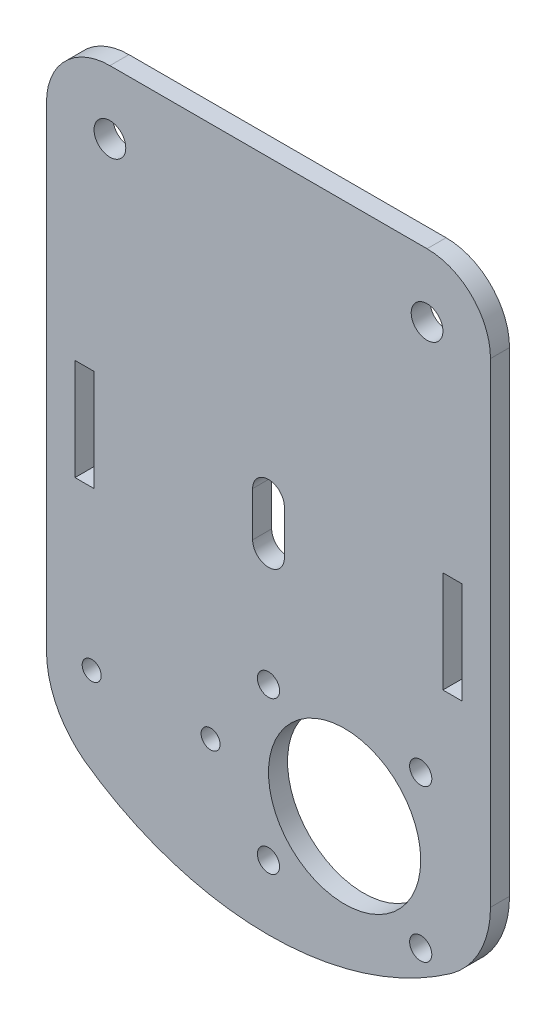
ISO-10303-21;
HEADER;
FILE_DESCRIPTION(('STEP AP214'),'2;1');
FILE_NAME('part.step','',(''),(''),'','','');
FILE_SCHEMA(('AUTOMOTIVE_DESIGN { 1 0 10303 214 1 1 1 1 }'));
ENDSEC;
DATA;
#1=APPLICATION_CONTEXT('core data for automotive mechanical design processes');
#2=APPLICATION_PROTOCOL_DEFINITION('international standard','automotive_design',2000,#1);
#3=PRODUCT_CONTEXT('',#1,'mechanical');
#4=PRODUCT('Part','Part','',(#3));
#5=PRODUCT_RELATED_PRODUCT_CATEGORY('part','',(#4));
#6=PRODUCT_DEFINITION_FORMATION('','',#4);
#7=PRODUCT_DEFINITION_CONTEXT('part definition',#1,'design');
#8=PRODUCT_DEFINITION('design','',#6,#7);
#9=PRODUCT_DEFINITION_SHAPE('','',#8);
#10=(LENGTH_UNIT() NAMED_UNIT(*) SI_UNIT(.MILLI.,.METRE.));
#11=(NAMED_UNIT(*) PLANE_ANGLE_UNIT() SI_UNIT($,.RADIAN.));
#12=(NAMED_UNIT(*) SI_UNIT($,.STERADIAN.) SOLID_ANGLE_UNIT());
#13=UNCERTAINTY_MEASURE_WITH_UNIT(LENGTH_MEASURE(1.E-05),#10,'distance_accuracy_value','');
#14=(GEOMETRIC_REPRESENTATION_CONTEXT(3) GLOBAL_UNCERTAINTY_ASSIGNED_CONTEXT((#13)) GLOBAL_UNIT_ASSIGNED_CONTEXT((#10,
#11,#12)) REPRESENTATION_CONTEXT('',''));
#15=CARTESIAN_POINT('',(0.,0.,0.));
#16=DIRECTION('',(0.,0.,1.));
#17=DIRECTION('',(1.,0.,0.));
#18=AXIS2_PLACEMENT_3D('',#15,#16,#17);
#19=CARTESIAN_POINT('',(0.,0.,3.));
#20=DIRECTION('',(0.,0.,1.));
#21=DIRECTION('',(1.,0.,0.));
#22=AXIS2_PLACEMENT_3D('',#19,#20,#21);
#23=PLANE('',#22);
#24=CARTESIAN_POINT('',(-27.875,-54.,3.));
#25=DIRECTION('',(0.,0.,1.));
#26=DIRECTION('',(1.,0.,0.));
#27=AXIS2_PLACEMENT_3D('',#24,#25,#26);
#28=CIRCLE('',#27,1.5);
#29=CARTESIAN_POINT('',(-26.375,-54.,3.));
#30=VERTEX_POINT('',#29);
#31=EDGE_CURVE('E514',#30,#30,#28,.T.);
#32=ORIENTED_EDGE('',*,*,#31,.F.);
#33=EDGE_LOOP('',(#32));
#34=FACE_BOUND('',#33,.T.);
#35=CARTESIAN_POINT('',(-9.12499999999999,-54.,3.));
#36=DIRECTION('',(0.,0.,1.));
#37=DIRECTION('',(1.,0.,0.));
#38=AXIS2_PLACEMENT_3D('',#35,#36,#37);
#39=CIRCLE('',#38,1.5);
#40=CARTESIAN_POINT('',(-7.62499999999999,-54.,3.));
#41=VERTEX_POINT('',#40);
#42=EDGE_CURVE('E202',#41,#41,#39,.T.);
#43=ORIENTED_EDGE('',*,*,#42,.F.);
#44=EDGE_LOOP('',(#43));
#45=FACE_BOUND('',#44,.T.);
#46=DIRECTION('',(0.,-1.,0.));
#47=VECTOR('',#46,1.);
#48=CARTESIAN_POINT('',(27.499999999993,-13.,3.));
#49=LINE('',#48,#47);
#50=CARTESIAN_POINT('',(27.499999999993,-13.,3.));
#51=VERTEX_POINT('',#50);
#52=CARTESIAN_POINT('',(27.499999999993,-29.,3.));
#53=VERTEX_POINT('',#52);
#54=EDGE_CURVE('E54',#51,#53,#49,.T.);
#55=ORIENTED_EDGE('',*,*,#54,.F.);
#56=DIRECTION('',(-1.,0.,0.));
#57=VECTOR('',#56,1.);
#58=CARTESIAN_POINT('',(27.499999999993,-13.,3.));
#59=LINE('',#58,#57);
#60=CARTESIAN_POINT('',(30.499999999993,-13.,3.));
#61=VERTEX_POINT('',#60);
#62=EDGE_CURVE('E196',#61,#51,#59,.T.);
#63=ORIENTED_EDGE('',*,*,#62,.F.);
#64=DIRECTION('',(0.,1.,0.));
#65=VECTOR('',#64,1.);
#66=CARTESIAN_POINT('',(30.499999999993,-13.,3.));
#67=LINE('',#66,#65);
#68=CARTESIAN_POINT('',(30.499999999993,-29.,3.));
#69=VERTEX_POINT('',#68);
#70=EDGE_CURVE('E199',#69,#61,#67,.T.);
#71=ORIENTED_EDGE('',*,*,#70,.F.);
#72=DIRECTION('',(1.,0.,0.));
#73=VECTOR('',#72,1.);
#74=CARTESIAN_POINT('',(27.499999999993,-29.,3.));
#75=LINE('',#74,#73);
#76=EDGE_CURVE('E208',#53,#69,#75,.T.);
#77=ORIENTED_EDGE('',*,*,#76,.F.);
#78=EDGE_LOOP('',(#55,#63,#71,#77));
#79=FACE_BOUND('',#78,.T.);
#80=DIRECTION('',(-1.,0.,0.));
#81=VECTOR('',#80,1.);
#82=CARTESIAN_POINT('',(-27.499999999993,-13.,3.));
#83=LINE('',#82,#81);
#84=CARTESIAN_POINT('',(-27.499999999993,-13.,3.));
#85=VERTEX_POINT('',#84);
#86=CARTESIAN_POINT('',(-30.499999999993,-13.,3.));
#87=VERTEX_POINT('',#86);
#88=EDGE_CURVE('E62',#85,#87,#83,.T.);
#89=ORIENTED_EDGE('',*,*,#88,.F.);
#90=DIRECTION('',(0.,1.,0.));
#91=VECTOR('',#90,1.);
#92=CARTESIAN_POINT('',(-27.499999999993,-13.,3.));
#93=LINE('',#92,#91);
#94=CARTESIAN_POINT('',(-27.499999999993,-29.,3.));
#95=VERTEX_POINT('',#94);
#96=EDGE_CURVE('E223',#95,#85,#93,.T.);
#97=ORIENTED_EDGE('',*,*,#96,.F.);
#98=DIRECTION('',(1.,0.,0.));
#99=VECTOR('',#98,1.);
#100=CARTESIAN_POINT('',(-27.499999999993,-29.,3.));
#101=LINE('',#100,#99);
#102=CARTESIAN_POINT('',(-30.499999999993,-29.,3.));
#103=VERTEX_POINT('',#102);
#104=EDGE_CURVE('E238',#103,#95,#101,.T.);
#105=ORIENTED_EDGE('',*,*,#104,.F.);
#106=DIRECTION('',(0.,-1.,0.));
#107=VECTOR('',#106,1.);
#108=CARTESIAN_POINT('',(-30.499999999993,-13.,3.));
#109=LINE('',#108,#107);
#110=EDGE_CURVE('E234',#87,#103,#109,.T.);
#111=ORIENTED_EDGE('',*,*,#110,.F.);
#112=EDGE_LOOP('',(#89,#97,#105,#111));
#113=FACE_BOUND('',#112,.T.);
#114=CARTESIAN_POINT('',(0.,-42.,3.));
#115=DIRECTION('',(0.,0.,1.));
#116=DIRECTION('',(1.,0.,0.));
#117=AXIS2_PLACEMENT_3D('',#114,#115,#116);
#118=CIRCLE('',#117,1.75);
#119=CARTESIAN_POINT('',(1.75,-42.,3.));
#120=VERTEX_POINT('',#119);
#121=EDGE_CURVE('E265',#120,#120,#118,.T.);
#122=ORIENTED_EDGE('',*,*,#121,.F.);
#123=EDGE_LOOP('',(#122));
#124=FACE_BOUND('',#123,.T.);
#125=CARTESIAN_POINT('',(0.,-66.,3.));
#126=DIRECTION('',(0.,0.,1.));
#127=DIRECTION('',(1.,0.,0.));
#128=AXIS2_PLACEMENT_3D('',#125,#126,#127);
#129=CIRCLE('',#128,1.75);
#130=CARTESIAN_POINT('',(1.75,-66.,3.));
#131=VERTEX_POINT('',#130);
#132=EDGE_CURVE('E258',#131,#131,#129,.T.);
#133=ORIENTED_EDGE('',*,*,#132,.F.);
#134=EDGE_LOOP('',(#133));
#135=FACE_BOUND('',#134,.T.);
#136=CARTESIAN_POINT('',(12.,-54.,3.));
#137=DIRECTION('',(0.,0.,1.));
#138=DIRECTION('',(1.,0.,0.));
#139=AXIS2_PLACEMENT_3D('',#136,#137,#138);
#140=CIRCLE('',#139,12.);
#141=CARTESIAN_POINT('',(24.,-54.,3.));
#142=VERTEX_POINT('',#141);
#143=EDGE_CURVE('E215',#142,#142,#140,.T.);
#144=ORIENTED_EDGE('',*,*,#143,.F.);
#145=EDGE_LOOP('',(#144));
#146=FACE_BOUND('',#145,.T.);
#147=CARTESIAN_POINT('',(24.,-66.,3.));
#148=DIRECTION('',(0.,0.,1.));
#149=DIRECTION('',(1.,0.,0.));
#150=AXIS2_PLACEMENT_3D('',#147,#148,#149);
#151=CIRCLE('',#150,1.75);
#152=CARTESIAN_POINT('',(25.75,-66.,3.));
#153=VERTEX_POINT('',#152);
#154=EDGE_CURVE('E252',#153,#153,#151,.T.);
#155=ORIENTED_EDGE('',*,*,#154,.F.);
#156=EDGE_LOOP('',(#155));
#157=FACE_BOUND('',#156,.T.);
#158=CARTESIAN_POINT('',(24.,-42.,3.));
#159=DIRECTION('',(0.,0.,1.));
#160=DIRECTION('',(1.,0.,0.));
#161=AXIS2_PLACEMENT_3D('',#158,#159,#160);
#162=CIRCLE('',#161,1.75);
#163=CARTESIAN_POINT('',(25.75,-42.,3.));
#164=VERTEX_POINT('',#163);
#165=EDGE_CURVE('E264',#164,#164,#162,.T.);
#166=ORIENTED_EDGE('',*,*,#165,.F.);
#167=EDGE_LOOP('',(#166));
#168=FACE_BOUND('',#167,.T.);
#169=CARTESIAN_POINT('',(25.,20.,3.));
#170=DIRECTION('',(0.,0.,1.));
#171=DIRECTION('',(1.,0.,0.));
#172=AXIS2_PLACEMENT_3D('',#169,#170,#171);
#173=CIRCLE('',#172,2.5);
#174=CARTESIAN_POINT('',(27.5,20.,3.));
#175=VERTEX_POINT('',#174);
#176=EDGE_CURVE('E317',#175,#175,#173,.T.);
#177=ORIENTED_EDGE('',*,*,#176,.F.);
#178=EDGE_LOOP('',(#177));
#179=FACE_BOUND('',#178,.T.);
#180=CARTESIAN_POINT('',(0.,-26.1955740754296,3.));
#181=DIRECTION('',(0.,0.,1.));
#182=DIRECTION('',(1.,0.,0.));
#183=AXIS2_PLACEMENT_3D('',#180,#181,#182);
#184=CIRCLE('',#183,50.);
#185=CARTESIAN_POINT('',(-28.8396434946598,-67.0400959002831,3.));
#186=VERTEX_POINT('',#185);
#187=CARTESIAN_POINT('',(28.8396434946598,-67.0400959002831,3.));
#188=VERTEX_POINT('',#187);
#189=EDGE_CURVE('E357',#186,#188,#184,.T.);
#190=ORIENTED_EDGE('',*,*,#189,.T.);
#191=CARTESIAN_POINT('',(20.,-54.9214861249285,3.));
#192=DIRECTION('',(0.,0.,1.));
#193=DIRECTION('',(1.,0.,0.));
#194=AXIS2_PLACEMENT_3D('',#191,#192,#193);
#195=CIRCLE('',#194,15.);
#196=CARTESIAN_POINT('',(35.,-54.9214861249285,3.));
#197=VERTEX_POINT('',#196);
#198=EDGE_CURVE('E359',#188,#197,#195,.T.);
#199=ORIENTED_EDGE('',*,*,#198,.T.);
#200=DIRECTION('',(0.,1.,0.));
#201=VECTOR('',#200,1.);
#202=CARTESIAN_POINT('',(35.,30.,3.));
#203=LINE('',#202,#201);
#204=CARTESIAN_POINT('',(35.,20.,3.));
#205=VERTEX_POINT('',#204);
#206=EDGE_CURVE('E323',#197,#205,#203,.T.);
#207=ORIENTED_EDGE('',*,*,#206,.T.);
#208=CARTESIAN_POINT('',(25.,20.,3.));
#209=DIRECTION('',(0.,0.,1.));
#210=DIRECTION('',(1.,0.,0.));
#211=AXIS2_PLACEMENT_3D('',#208,#209,#210);
#212=CIRCLE('',#211,10.);
#213=CARTESIAN_POINT('',(25.,30.,3.));
#214=VERTEX_POINT('',#213);
#215=EDGE_CURVE('E351',#205,#214,#212,.T.);
#216=ORIENTED_EDGE('',*,*,#215,.T.);
#217=DIRECTION('',(-1.,0.,0.));
#218=VECTOR('',#217,1.);
#219=CARTESIAN_POINT('',(-35.,30.,3.));
#220=LINE('',#219,#218);
#221=CARTESIAN_POINT('',(-25.,30.,3.));
#222=VERTEX_POINT('',#221);
#223=EDGE_CURVE('E326',#214,#222,#220,.T.);
#224=ORIENTED_EDGE('',*,*,#223,.T.);
#225=CARTESIAN_POINT('',(-25.,20.,3.));
#226=DIRECTION('',(0.,0.,1.));
#227=DIRECTION('',(1.,0.,0.));
#228=AXIS2_PLACEMENT_3D('',#225,#226,#227);
#229=CIRCLE('',#228,10.);
#230=CARTESIAN_POINT('',(-35.,20.,3.));
#231=VERTEX_POINT('',#230);
#232=EDGE_CURVE('E353',#222,#231,#229,.T.);
#233=ORIENTED_EDGE('',*,*,#232,.T.);
#234=DIRECTION('',(0.,-1.,0.));
#235=VECTOR('',#234,1.);
#236=CARTESIAN_POINT('',(-35.,-62.6407545543055,3.));
#237=LINE('',#236,#235);
#238=CARTESIAN_POINT('',(-35.,-54.9214861249285,3.));
#239=VERTEX_POINT('',#238);
#240=EDGE_CURVE('E330',#231,#239,#237,.T.);
#241=ORIENTED_EDGE('',*,*,#240,.T.);
#242=CARTESIAN_POINT('',(-20.,-54.9214861249285,3.));
#243=DIRECTION('',(0.,0.,1.));
#244=DIRECTION('',(1.,0.,0.));
#245=AXIS2_PLACEMENT_3D('',#242,#243,#244);
#246=CIRCLE('',#245,15.);
#247=EDGE_CURVE('E355',#239,#186,#246,.T.);
#248=ORIENTED_EDGE('',*,*,#247,.T.);
#249=EDGE_LOOP('',(#190,#199,#207,#216,#224,#233,#241,#248));
#250=FACE_BOUND('',#249,.T.);
#251=CARTESIAN_POINT('',(-25.,20.,3.));
#252=DIRECTION('',(0.,0.,1.));
#253=DIRECTION('',(1.,0.,0.));
#254=AXIS2_PLACEMENT_3D('',#251,#252,#253);
#255=CIRCLE('',#254,2.5);
#256=CARTESIAN_POINT('',(-22.5,20.,3.));
#257=VERTEX_POINT('',#256);
#258=EDGE_CURVE('E311',#257,#257,#255,.T.);
#259=ORIENTED_EDGE('',*,*,#258,.F.);
#260=EDGE_LOOP('',(#259));
#261=FACE_BOUND('',#260,.T.);
#262=DIRECTION('',(0.,-1.,0.));
#263=VECTOR('',#262,1.);
#264=CARTESIAN_POINT('',(-2.50000000000698,-16.5,3.));
#265=LINE('',#264,#263);
#266=CARTESIAN_POINT('',(-2.50000000000698,-16.5,3.));
#267=VERTEX_POINT('',#266);
#268=CARTESIAN_POINT('',(-2.50000000000698,-23.5,3.));
#269=VERTEX_POINT('',#268);
#270=EDGE_CURVE('E281',#267,#269,#265,.T.);
#271=ORIENTED_EDGE('',*,*,#270,.F.);
#272=CARTESIAN_POINT('',(-6.97987588455585E-12,-16.5000000000001,3.));
#273=DIRECTION('',(0.,0.,1.));
#274=DIRECTION('',(1.,0.,0.));
#275=AXIS2_PLACEMENT_3D('',#272,#273,#274);
#276=CIRCLE('',#275,2.5);
#277=CARTESIAN_POINT('',(2.49999999999302,-16.5,3.));
#278=VERTEX_POINT('',#277);
#279=EDGE_CURVE('E279',#278,#267,#276,.T.);
#280=ORIENTED_EDGE('',*,*,#279,.F.);
#281=DIRECTION('',(0.,1.,0.));
#282=VECTOR('',#281,1.);
#283=CARTESIAN_POINT('',(2.49999999999302,-16.5,3.));
#284=LINE('',#283,#282);
#285=CARTESIAN_POINT('',(2.49999999999302,-23.5,3.));
#286=VERTEX_POINT('',#285);
#287=EDGE_CURVE('E287',#286,#278,#284,.T.);
#288=ORIENTED_EDGE('',*,*,#287,.F.);
#289=CARTESIAN_POINT('',(-6.98116176369495E-12,-23.5,3.));
#290=DIRECTION('',(0.,0.,1.));
#291=DIRECTION('',(1.,0.,0.));
#292=AXIS2_PLACEMENT_3D('',#289,#290,#291);
#293=CIRCLE('',#292,2.5);
#294=EDGE_CURVE('E284',#269,#286,#293,.T.);
#295=ORIENTED_EDGE('',*,*,#294,.F.);
#296=EDGE_LOOP('',(#271,#280,#288,#295));
#297=FACE_BOUND('',#296,.T.);
#298=ADVANCED_FACE('F37',(#34,#45,#79,#113,#124,#135,#146,#157,#168,#179,#250,#261,#297),#23,.T.);
#299=CARTESIAN_POINT('',(0.,0.,0.));
#300=DIRECTION('',(0.,0.,1.));
#301=DIRECTION('',(1.,0.,0.));
#302=AXIS2_PLACEMENT_3D('',#299,#300,#301);
#303=PLANE('',#302);
#304=CARTESIAN_POINT('',(-27.875,-54.,0.));
#305=DIRECTION('',(0.,0.,1.));
#306=DIRECTION('',(1.,0.,0.));
#307=AXIS2_PLACEMENT_3D('',#304,#305,#306);
#308=CIRCLE('',#307,1.5);
#309=CARTESIAN_POINT('',(-26.375,-54.,0.));
#310=VERTEX_POINT('',#309);
#311=EDGE_CURVE('E235',#310,#310,#308,.T.);
#312=ORIENTED_EDGE('',*,*,#311,.T.);
#313=EDGE_LOOP('',(#312));
#314=FACE_BOUND('',#313,.T.);
#315=CARTESIAN_POINT('',(-9.12499999999999,-54.,0.));
#316=DIRECTION('',(0.,0.,1.));
#317=DIRECTION('',(1.,0.,0.));
#318=AXIS2_PLACEMENT_3D('',#315,#316,#317);
#319=CIRCLE('',#318,1.5);
#320=CARTESIAN_POINT('',(-7.62499999999999,-54.,0.));
#321=VERTEX_POINT('',#320);
#322=EDGE_CURVE('E515',#321,#321,#319,.T.);
#323=ORIENTED_EDGE('',*,*,#322,.T.);
#324=EDGE_LOOP('',(#323));
#325=FACE_BOUND('',#324,.T.);
#326=DIRECTION('',(-1.,0.,0.));
#327=VECTOR('',#326,1.);
#328=CARTESIAN_POINT('',(27.499999999993,-13.,0.));
#329=LINE('',#328,#327);
#330=CARTESIAN_POINT('',(30.499999999993,-13.,0.));
#331=VERTEX_POINT('',#330);
#332=CARTESIAN_POINT('',(27.499999999993,-13.,0.));
#333=VERTEX_POINT('',#332);
#334=EDGE_CURVE('E183',#331,#333,#329,.T.);
#335=ORIENTED_EDGE('',*,*,#334,.T.);
#336=DIRECTION('',(0.,-1.,0.));
#337=VECTOR('',#336,1.);
#338=CARTESIAN_POINT('',(27.499999999993,-13.,0.));
#339=LINE('',#338,#337);
#340=CARTESIAN_POINT('',(27.499999999993,-29.,0.));
#341=VERTEX_POINT('',#340);
#342=EDGE_CURVE('E177',#333,#341,#339,.T.);
#343=ORIENTED_EDGE('',*,*,#342,.T.);
#344=DIRECTION('',(1.,0.,0.));
#345=VECTOR('',#344,1.);
#346=CARTESIAN_POINT('',(27.499999999993,-29.,0.));
#347=LINE('',#346,#345);
#348=CARTESIAN_POINT('',(30.499999999993,-29.,0.));
#349=VERTEX_POINT('',#348);
#350=EDGE_CURVE('E187',#341,#349,#347,.T.);
#351=ORIENTED_EDGE('',*,*,#350,.T.);
#352=DIRECTION('',(0.,1.,0.));
#353=VECTOR('',#352,1.);
#354=CARTESIAN_POINT('',(30.499999999993,-13.,0.));
#355=LINE('',#354,#353);
#356=EDGE_CURVE('E191',#349,#331,#355,.T.);
#357=ORIENTED_EDGE('',*,*,#356,.T.);
#358=EDGE_LOOP('',(#335,#343,#351,#357));
#359=FACE_BOUND('',#358,.T.);
#360=DIRECTION('',(0.,1.,0.));
#361=VECTOR('',#360,1.);
#362=CARTESIAN_POINT('',(-27.499999999993,-13.,0.));
#363=LINE('',#362,#361);
#364=CARTESIAN_POINT('',(-27.499999999993,-29.,0.));
#365=VERTEX_POINT('',#364);
#366=CARTESIAN_POINT('',(-27.499999999993,-13.,0.));
#367=VERTEX_POINT('',#366);
#368=EDGE_CURVE('E229',#365,#367,#363,.T.);
#369=ORIENTED_EDGE('',*,*,#368,.T.);
#370=DIRECTION('',(-1.,0.,0.));
#371=VECTOR('',#370,1.);
#372=CARTESIAN_POINT('',(-27.499999999993,-13.,0.));
#373=LINE('',#372,#371);
#374=CARTESIAN_POINT('',(-30.499999999993,-13.,0.));
#375=VERTEX_POINT('',#374);
#376=EDGE_CURVE('E219',#367,#375,#373,.T.);
#377=ORIENTED_EDGE('',*,*,#376,.T.);
#378=DIRECTION('',(0.,-1.,0.));
#379=VECTOR('',#378,1.);
#380=CARTESIAN_POINT('',(-30.499999999993,-13.,0.));
#381=LINE('',#380,#379);
#382=CARTESIAN_POINT('',(-30.499999999993,-29.,0.));
#383=VERTEX_POINT('',#382);
#384=EDGE_CURVE('E222',#375,#383,#381,.T.);
#385=ORIENTED_EDGE('',*,*,#384,.T.);
#386=DIRECTION('',(1.,0.,0.));
#387=VECTOR('',#386,1.);
#388=CARTESIAN_POINT('',(-27.499999999993,-29.,0.));
#389=LINE('',#388,#387);
#390=EDGE_CURVE('E226',#383,#365,#389,.T.);
#391=ORIENTED_EDGE('',*,*,#390,.T.);
#392=EDGE_LOOP('',(#369,#377,#385,#391));
#393=FACE_BOUND('',#392,.T.);
#394=CARTESIAN_POINT('',(0.,-42.,0.));
#395=DIRECTION('',(0.,0.,1.));
#396=DIRECTION('',(1.,0.,0.));
#397=AXIS2_PLACEMENT_3D('',#394,#395,#396);
#398=CIRCLE('',#397,1.75);
#399=CARTESIAN_POINT('',(1.75,-42.,0.));
#400=VERTEX_POINT('',#399);
#401=EDGE_CURVE('E261',#400,#400,#398,.T.);
#402=ORIENTED_EDGE('',*,*,#401,.T.);
#403=EDGE_LOOP('',(#402));
#404=FACE_BOUND('',#403,.T.);
#405=CARTESIAN_POINT('',(0.,-66.,0.));
#406=DIRECTION('',(0.,0.,1.));
#407=DIRECTION('',(1.,0.,0.));
#408=AXIS2_PLACEMENT_3D('',#405,#406,#407);
#409=CIRCLE('',#408,1.75);
#410=CARTESIAN_POINT('',(1.75,-66.,0.));
#411=VERTEX_POINT('',#410);
#412=EDGE_CURVE('E268',#411,#411,#409,.T.);
#413=ORIENTED_EDGE('',*,*,#412,.T.);
#414=EDGE_LOOP('',(#413));
#415=FACE_BOUND('',#414,.T.);
#416=CARTESIAN_POINT('',(12.,-54.,0.));
#417=DIRECTION('',(0.,0.,1.));
#418=DIRECTION('',(1.,0.,0.));
#419=AXIS2_PLACEMENT_3D('',#416,#417,#418);
#420=CIRCLE('',#419,12.);
#421=CARTESIAN_POINT('',(24.,-54.,0.));
#422=VERTEX_POINT('',#421);
#423=EDGE_CURVE('E249',#422,#422,#420,.T.);
#424=ORIENTED_EDGE('',*,*,#423,.T.);
#425=EDGE_LOOP('',(#424));
#426=FACE_BOUND('',#425,.T.);
#427=CARTESIAN_POINT('',(24.,-66.,0.));
#428=DIRECTION('',(0.,0.,1.));
#429=DIRECTION('',(1.,0.,0.));
#430=AXIS2_PLACEMENT_3D('',#427,#428,#429);
#431=CIRCLE('',#430,1.75);
#432=CARTESIAN_POINT('',(25.75,-66.,0.));
#433=VERTEX_POINT('',#432);
#434=EDGE_CURVE('E255',#433,#433,#431,.T.);
#435=ORIENTED_EDGE('',*,*,#434,.T.);
#436=EDGE_LOOP('',(#435));
#437=FACE_BOUND('',#436,.T.);
#438=CARTESIAN_POINT('',(24.,-42.,0.));
#439=DIRECTION('',(0.,0.,1.));
#440=DIRECTION('',(1.,0.,0.));
#441=AXIS2_PLACEMENT_3D('',#438,#439,#440);
#442=CIRCLE('',#441,1.75);
#443=CARTESIAN_POINT('',(25.75,-42.,0.));
#444=VERTEX_POINT('',#443);
#445=EDGE_CURVE('E273',#444,#444,#442,.T.);
#446=ORIENTED_EDGE('',*,*,#445,.T.);
#447=EDGE_LOOP('',(#446));
#448=FACE_BOUND('',#447,.T.);
#449=CARTESIAN_POINT('',(-25.,20.,0.));
#450=DIRECTION('',(0.,0.,1.));
#451=DIRECTION('',(1.,0.,0.));
#452=AXIS2_PLACEMENT_3D('',#449,#450,#451);
#453=CIRCLE('',#452,2.5);
#454=CARTESIAN_POINT('',(-22.5,20.,0.));
#455=VERTEX_POINT('',#454);
#456=EDGE_CURVE('E310',#455,#455,#453,.T.);
#457=ORIENTED_EDGE('',*,*,#456,.T.);
#458=EDGE_LOOP('',(#457));
#459=FACE_BOUND('',#458,.T.);
#460=CARTESIAN_POINT('',(25.,20.,0.));
#461=DIRECTION('',(0.,0.,1.));
#462=DIRECTION('',(1.,0.,0.));
#463=AXIS2_PLACEMENT_3D('',#460,#461,#462);
#464=CIRCLE('',#463,2.5);
#465=CARTESIAN_POINT('',(27.5,20.,0.));
#466=VERTEX_POINT('',#465);
#467=EDGE_CURVE('E314',#466,#466,#464,.T.);
#468=ORIENTED_EDGE('',*,*,#467,.T.);
#469=EDGE_LOOP('',(#468));
#470=FACE_BOUND('',#469,.T.);
#471=DIRECTION('',(0.,1.,0.));
#472=VECTOR('',#471,1.);
#473=CARTESIAN_POINT('',(35.,30.,0.));
#474=LINE('',#473,#472);
#475=CARTESIAN_POINT('',(35.,-54.9214861249285,0.));
#476=VERTEX_POINT('',#475);
#477=CARTESIAN_POINT('',(35.,20.,0.));
#478=VERTEX_POINT('',#477);
#479=EDGE_CURVE('E320',#476,#478,#474,.T.);
#480=ORIENTED_EDGE('',*,*,#479,.F.);
#481=CARTESIAN_POINT('',(20.,-54.9214861249285,0.));
#482=DIRECTION('',(0.,0.,1.));
#483=DIRECTION('',(1.,0.,0.));
#484=AXIS2_PLACEMENT_3D('',#481,#482,#483);
#485=CIRCLE('',#484,15.);
#486=CARTESIAN_POINT('',(28.8396434946598,-67.0400959002831,0.));
#487=VERTEX_POINT('',#486);
#488=EDGE_CURVE('E349',#476,#487,#485,.F.);
#489=ORIENTED_EDGE('',*,*,#488,.T.);
#490=CARTESIAN_POINT('',(0.,-26.1955740754296,0.));
#491=DIRECTION('',(0.,0.,1.));
#492=DIRECTION('',(1.,0.,0.));
#493=AXIS2_PLACEMENT_3D('',#490,#491,#492);
#494=CIRCLE('',#493,50.);
#495=CARTESIAN_POINT('',(-28.8396434946598,-67.0400959002831,0.));
#496=VERTEX_POINT('',#495);
#497=EDGE_CURVE('E346',#487,#496,#494,.F.);
#498=ORIENTED_EDGE('',*,*,#497,.T.);
#499=CARTESIAN_POINT('',(-20.,-54.9214861249285,0.));
#500=DIRECTION('',(0.,0.,1.));
#501=DIRECTION('',(1.,0.,0.));
#502=AXIS2_PLACEMENT_3D('',#499,#500,#501);
#503=CIRCLE('',#502,15.);
#504=CARTESIAN_POINT('',(-35.,-54.9214861249285,0.));
#505=VERTEX_POINT('',#504);
#506=EDGE_CURVE('E344',#496,#505,#503,.F.);
#507=ORIENTED_EDGE('',*,*,#506,.T.);
#508=DIRECTION('',(0.,-1.,0.));
#509=VECTOR('',#508,1.);
#510=CARTESIAN_POINT('',(-35.,-62.6407545543055,0.));
#511=LINE('',#510,#509);
#512=CARTESIAN_POINT('',(-35.,20.,0.));
#513=VERTEX_POINT('',#512);
#514=EDGE_CURVE('E327',#513,#505,#511,.T.);
#515=ORIENTED_EDGE('',*,*,#514,.F.);
#516=CARTESIAN_POINT('',(-25.,20.,0.));
#517=DIRECTION('',(0.,0.,1.));
#518=DIRECTION('',(1.,0.,0.));
#519=AXIS2_PLACEMENT_3D('',#516,#517,#518);
#520=CIRCLE('',#519,10.);
#521=CARTESIAN_POINT('',(-25.,30.,0.));
#522=VERTEX_POINT('',#521);
#523=EDGE_CURVE('E342',#513,#522,#520,.F.);
#524=ORIENTED_EDGE('',*,*,#523,.T.);
#525=DIRECTION('',(-1.,0.,0.));
#526=VECTOR('',#525,1.);
#527=CARTESIAN_POINT('',(-35.,30.,0.));
#528=LINE('',#527,#526);
#529=CARTESIAN_POINT('',(25.,30.,0.));
#530=VERTEX_POINT('',#529);
#531=EDGE_CURVE('E336',#530,#522,#528,.T.);
#532=ORIENTED_EDGE('',*,*,#531,.F.);
#533=CARTESIAN_POINT('',(25.,20.,0.));
#534=DIRECTION('',(0.,0.,1.));
#535=DIRECTION('',(1.,0.,0.));
#536=AXIS2_PLACEMENT_3D('',#533,#534,#535);
#537=CIRCLE('',#536,10.);
#538=EDGE_CURVE('E333',#530,#478,#537,.F.);
#539=ORIENTED_EDGE('',*,*,#538,.T.);
#540=EDGE_LOOP('',(#480,#489,#498,#507,#515,#524,#532,#539));
#541=FACE_BOUND('',#540,.T.);
#542=CARTESIAN_POINT('',(-6.97987588455585E-12,-16.5000000000001,0.));
#543=DIRECTION('',(0.,0.,1.));
#544=DIRECTION('',(1.,0.,0.));
#545=AXIS2_PLACEMENT_3D('',#542,#543,#544);
#546=CIRCLE('',#545,2.5);
#547=CARTESIAN_POINT('',(2.49999999999302,-16.5,0.));
#548=VERTEX_POINT('',#547);
#549=CARTESIAN_POINT('',(-2.50000000000698,-16.5,0.));
#550=VERTEX_POINT('',#549);
#551=EDGE_CURVE('E290',#548,#550,#546,.T.);
#552=ORIENTED_EDGE('',*,*,#551,.T.);
#553=DIRECTION('',(0.,-1.,0.));
#554=VECTOR('',#553,1.);
#555=CARTESIAN_POINT('',(-2.50000000000698,-16.5,0.));
#556=LINE('',#555,#554);
#557=CARTESIAN_POINT('',(-2.50000000000698,-23.5,0.));
#558=VERTEX_POINT('',#557);
#559=EDGE_CURVE('E293',#550,#558,#556,.T.);
#560=ORIENTED_EDGE('',*,*,#559,.T.);
#561=CARTESIAN_POINT('',(-6.98116176369495E-12,-23.5,0.));
#562=DIRECTION('',(0.,0.,1.));
#563=DIRECTION('',(1.,0.,0.));
#564=AXIS2_PLACEMENT_3D('',#561,#562,#563);
#565=CIRCLE('',#564,2.5);
#566=CARTESIAN_POINT('',(2.49999999999302,-23.5,0.));
#567=VERTEX_POINT('',#566);
#568=EDGE_CURVE('E296',#558,#567,#565,.T.);
#569=ORIENTED_EDGE('',*,*,#568,.T.);
#570=DIRECTION('',(0.,1.,0.));
#571=VECTOR('',#570,1.);
#572=CARTESIAN_POINT('',(2.49999999999302,-16.5,0.));
#573=LINE('',#572,#571);
#574=EDGE_CURVE('E282',#567,#548,#573,.T.);
#575=ORIENTED_EDGE('',*,*,#574,.T.);
#576=EDGE_LOOP('',(#552,#560,#569,#575));
#577=FACE_BOUND('',#576,.T.);
#578=ADVANCED_FACE('F193',(#314,#325,#359,#393,#404,#415,#426,#437,#448,#459,#470,#541,#577),
#303,.F.);
#579=CARTESIAN_POINT('',(35.,30.,3.));
#580=DIRECTION('',(-1.,0.,0.));
#581=DIRECTION('',(0.,0.,1.));
#582=AXIS2_PLACEMENT_3D('',#579,#580,#581);
#583=PLANE('',#582);
#584=ORIENTED_EDGE('',*,*,#206,.F.);
#585=DIRECTION('',(0.,0.,-1.));
#586=VECTOR('',#585,1.);
#587=CARTESIAN_POINT('',(35.,-54.9214861249285,3.));
#588=LINE('',#587,#586);
#589=EDGE_CURVE('E363',#197,#476,#588,.T.);
#590=ORIENTED_EDGE('',*,*,#589,.T.);
#591=ORIENTED_EDGE('',*,*,#479,.T.);
#592=DIRECTION('',(0.,0.,-1.));
#593=VECTOR('',#592,1.);
#594=CARTESIAN_POINT('',(35.,20.,3.));
#595=LINE('',#594,#593);
#596=EDGE_CURVE('E361',#478,#205,#595,.F.);
#597=ORIENTED_EDGE('',*,*,#596,.T.);
#598=EDGE_LOOP('',(#584,#590,#591,#597));
#599=FACE_BOUND('',#598,.T.);
#600=ADVANCED_FACE('F397',(#599),#583,.F.);
#601=CARTESIAN_POINT('',(-35.,30.,3.));
#602=DIRECTION('',(0.,-1.,0.));
#603=DIRECTION('',(0.,0.,-1.));
#604=AXIS2_PLACEMENT_3D('',#601,#602,#603);
#605=PLANE('',#604);
#606=ORIENTED_EDGE('',*,*,#531,.T.);
#607=DIRECTION('',(0.,0.,-1.));
#608=VECTOR('',#607,1.);
#609=CARTESIAN_POINT('',(-25.,30.,3.));
#610=LINE('',#609,#608);
#611=EDGE_CURVE('E12',#522,#222,#610,.F.);
#612=ORIENTED_EDGE('',*,*,#611,.T.);
#613=ORIENTED_EDGE('',*,*,#223,.F.);
#614=DIRECTION('',(0.,0.,-1.));
#615=VECTOR('',#614,1.);
#616=CARTESIAN_POINT('',(25.,30.,3.));
#617=LINE('',#616,#615);
#618=EDGE_CURVE('E46',#214,#530,#617,.T.);
#619=ORIENTED_EDGE('',*,*,#618,.T.);
#620=EDGE_LOOP('',(#606,#612,#613,#619));
#621=FACE_BOUND('',#620,.T.);
#622=ADVANCED_FACE('F404',(#621),#605,.F.);
#623=CARTESIAN_POINT('',(-35.,-62.6407545543055,3.));
#624=DIRECTION('',(1.,0.,0.));
#625=DIRECTION('',(0.,0.,-1.));
#626=AXIS2_PLACEMENT_3D('',#623,#624,#625);
#627=PLANE('',#626);
#628=ORIENTED_EDGE('',*,*,#514,.T.);
#629=DIRECTION('',(0.,0.,-1.));
#630=VECTOR('',#629,1.);
#631=CARTESIAN_POINT('',(-35.,-54.9214861249285,3.));
#632=LINE('',#631,#630);
#633=EDGE_CURVE('E368',#505,#239,#632,.F.);
#634=ORIENTED_EDGE('',*,*,#633,.T.);
#635=ORIENTED_EDGE('',*,*,#240,.F.);
#636=DIRECTION('',(0.,0.,-1.));
#637=VECTOR('',#636,1.);
#638=CARTESIAN_POINT('',(-35.,20.,3.));
#639=LINE('',#638,#637);
#640=EDGE_CURVE('E365',#231,#513,#639,.T.);
#641=ORIENTED_EDGE('',*,*,#640,.T.);
#642=EDGE_LOOP('',(#628,#634,#635,#641));
#643=FACE_BOUND('',#642,.T.);
#644=ADVANCED_FACE('F412',(#643),#627,.F.);
#645=CARTESIAN_POINT('',(25.,20.,3.));
#646=DIRECTION('',(0.,0.,-1.));
#647=DIRECTION('',(-1.,0.,0.));
#648=AXIS2_PLACEMENT_3D('',#645,#646,#647);
#649=CYLINDRICAL_SURFACE('',#648,2.5);
#650=ORIENTED_EDGE('',*,*,#176,.T.);
#651=EDGE_LOOP('',(#650));
#652=FACE_BOUND('',#651,.T.);
#653=ORIENTED_EDGE('',*,*,#467,.F.);
#654=EDGE_LOOP('',(#653));
#655=FACE_BOUND('',#654,.T.);
#656=ADVANCED_FACE('F414',(#652,#655),#649,.F.);
#657=CARTESIAN_POINT('',(-25.,20.,3.));
#658=DIRECTION('',(0.,0.,-1.));
#659=DIRECTION('',(-1.,0.,0.));
#660=AXIS2_PLACEMENT_3D('',#657,#658,#659);
#661=CYLINDRICAL_SURFACE('',#660,2.5);
#662=ORIENTED_EDGE('',*,*,#258,.T.);
#663=EDGE_LOOP('',(#662));
#664=FACE_BOUND('',#663,.T.);
#665=ORIENTED_EDGE('',*,*,#456,.F.);
#666=EDGE_LOOP('',(#665));
#667=FACE_BOUND('',#666,.T.);
#668=ADVANCED_FACE('F420',(#664,#667),#661,.F.);
#669=CARTESIAN_POINT('',(-6.97987588455585E-12,-16.5000000000001,3.));
#670=DIRECTION('',(0.,0.,-1.));
#671=DIRECTION('',(-1.,0.,0.));
#672=AXIS2_PLACEMENT_3D('',#669,#670,#671);
#673=CYLINDRICAL_SURFACE('',#672,2.5);
#674=ORIENTED_EDGE('',*,*,#551,.F.);
#675=DIRECTION('',(0.,0.,-1.));
#676=VECTOR('',#675,1.);
#677=CARTESIAN_POINT('',(2.49999999999302,-16.5,3.));
#678=LINE('',#677,#676);
#679=EDGE_CURVE('E289',#278,#548,#678,.T.);
#680=ORIENTED_EDGE('',*,*,#679,.F.);
#681=ORIENTED_EDGE('',*,*,#279,.T.);
#682=DIRECTION('',(0.,0.,-1.));
#683=VECTOR('',#682,1.);
#684=CARTESIAN_POINT('',(-2.50000000000698,-16.5,3.));
#685=LINE('',#684,#683);
#686=EDGE_CURVE('E307',#267,#550,#685,.T.);
#687=ORIENTED_EDGE('',*,*,#686,.T.);
#688=EDGE_LOOP('',(#674,#680,#681,#687));
#689=FACE_BOUND('',#688,.T.);
#690=ADVANCED_FACE('F437',(#689),#673,.F.);
#691=CARTESIAN_POINT('',(-2.50000000000698,-16.5,3.));
#692=DIRECTION('',(1.,0.,0.));
#693=DIRECTION('',(0.,1.,0.));
#694=AXIS2_PLACEMENT_3D('',#691,#692,#693);
#695=PLANE('',#694);
#696=ORIENTED_EDGE('',*,*,#559,.F.);
#697=ORIENTED_EDGE('',*,*,#686,.F.);
#698=ORIENTED_EDGE('',*,*,#270,.T.);
#699=DIRECTION('',(0.,0.,-1.));
#700=VECTOR('',#699,1.);
#701=CARTESIAN_POINT('',(-2.50000000000698,-23.5,3.));
#702=LINE('',#701,#700);
#703=EDGE_CURVE('E305',#269,#558,#702,.T.);
#704=ORIENTED_EDGE('',*,*,#703,.T.);
#705=EDGE_LOOP('',(#696,#697,#698,#704));
#706=FACE_BOUND('',#705,.T.);
#707=ADVANCED_FACE('F441',(#706),#695,.T.);
#708=CARTESIAN_POINT('',(-6.98116176369495E-12,-23.5,3.));
#709=DIRECTION('',(0.,0.,-1.));
#710=DIRECTION('',(-1.,0.,0.));
#711=AXIS2_PLACEMENT_3D('',#708,#709,#710);
#712=CYLINDRICAL_SURFACE('',#711,2.5);
#713=ORIENTED_EDGE('',*,*,#568,.F.);
#714=ORIENTED_EDGE('',*,*,#703,.F.);
#715=ORIENTED_EDGE('',*,*,#294,.T.);
#716=DIRECTION('',(0.,0.,-1.));
#717=VECTOR('',#716,1.);
#718=CARTESIAN_POINT('',(2.49999999999302,-23.5,3.));
#719=LINE('',#718,#717);
#720=EDGE_CURVE('E303',#286,#567,#719,.T.);
#721=ORIENTED_EDGE('',*,*,#720,.T.);
#722=EDGE_LOOP('',(#713,#714,#715,#721));
#723=FACE_BOUND('',#722,.T.);
#724=ADVANCED_FACE('F445',(#723),#712,.F.);
#725=CARTESIAN_POINT('',(2.49999999999302,-16.5,3.));
#726=DIRECTION('',(-1.,0.,0.));
#727=DIRECTION('',(0.,-1.,0.));
#728=AXIS2_PLACEMENT_3D('',#725,#726,#727);
#729=PLANE('',#728);
#730=ORIENTED_EDGE('',*,*,#574,.F.);
#731=ORIENTED_EDGE('',*,*,#720,.F.);
#732=ORIENTED_EDGE('',*,*,#287,.T.);
#733=ORIENTED_EDGE('',*,*,#679,.T.);
#734=EDGE_LOOP('',(#730,#731,#732,#733));
#735=FACE_BOUND('',#734,.T.);
#736=ADVANCED_FACE('F449',(#735),#729,.T.);
#737=CARTESIAN_POINT('',(-20.,-54.9214861249285,3.));
#738=DIRECTION('',(0.,0.,-1.));
#739=DIRECTION('',(-1.,0.,0.));
#740=AXIS2_PLACEMENT_3D('',#737,#738,#739);
#741=CYLINDRICAL_SURFACE('',#740,15.);
#742=ORIENTED_EDGE('',*,*,#633,.F.);
#743=ORIENTED_EDGE('',*,*,#506,.F.);
#744=DIRECTION('',(0.,0.,-1.));
#745=VECTOR('',#744,1.);
#746=CARTESIAN_POINT('',(-28.8396434946598,-67.040095900283,1.5));
#747=LINE('',#746,#745);
#748=EDGE_CURVE('E41',#186,#496,#747,.T.);
#749=ORIENTED_EDGE('',*,*,#748,.F.);
#750=ORIENTED_EDGE('',*,*,#247,.F.);
#751=EDGE_LOOP('',(#742,#743,#749,#750));
#752=FACE_BOUND('',#751,.T.);
#753=ADVANCED_FACE('F382',(#752),#741,.T.);
#754=CARTESIAN_POINT('',(20.,-54.9214861249285,3.));
#755=DIRECTION('',(0.,0.,-1.));
#756=DIRECTION('',(-1.,0.,0.));
#757=AXIS2_PLACEMENT_3D('',#754,#755,#756);
#758=CYLINDRICAL_SURFACE('',#757,15.);
#759=ORIENTED_EDGE('',*,*,#589,.F.);
#760=ORIENTED_EDGE('',*,*,#198,.F.);
#761=DIRECTION('',(0.,0.,-1.));
#762=VECTOR('',#761,1.);
#763=CARTESIAN_POINT('',(28.8396434946598,-67.040095900283,1.5));
#764=LINE('',#763,#762);
#765=EDGE_CURVE('E276',#487,#188,#764,.F.);
#766=ORIENTED_EDGE('',*,*,#765,.F.);
#767=ORIENTED_EDGE('',*,*,#488,.F.);
#768=EDGE_LOOP('',(#759,#760,#766,#767));
#769=FACE_BOUND('',#768,.T.);
#770=ADVANCED_FACE('F391',(#769),#758,.T.);
#771=CARTESIAN_POINT('',(0.,-26.1955740754296,3.));
#772=DIRECTION('',(0.,0.,-1.));
#773=DIRECTION('',(-1.,0.,0.));
#774=AXIS2_PLACEMENT_3D('',#771,#772,#773);
#775=CYLINDRICAL_SURFACE('',#774,50.);
#776=ORIENTED_EDGE('',*,*,#189,.F.);
#777=ORIENTED_EDGE('',*,*,#748,.T.);
#778=ORIENTED_EDGE('',*,*,#497,.F.);
#779=ORIENTED_EDGE('',*,*,#765,.T.);
#780=EDGE_LOOP('',(#776,#777,#778,#779));
#781=FACE_BOUND('',#780,.T.);
#782=ADVANCED_FACE('F378',(#781),#775,.T.);
#783=CARTESIAN_POINT('',(-25.,20.,3.));
#784=DIRECTION('',(0.,0.,-1.));
#785=DIRECTION('',(-1.,0.,0.));
#786=AXIS2_PLACEMENT_3D('',#783,#784,#785);
#787=CYLINDRICAL_SURFACE('',#786,10.);
#788=ORIENTED_EDGE('',*,*,#232,.F.);
#789=ORIENTED_EDGE('',*,*,#611,.F.);
#790=ORIENTED_EDGE('',*,*,#523,.F.);
#791=ORIENTED_EDGE('',*,*,#640,.F.);
#792=EDGE_LOOP('',(#788,#789,#790,#791));
#793=FACE_BOUND('',#792,.T.);
#794=ADVANCED_FACE('F408',(#793),#787,.T.);
#795=CARTESIAN_POINT('',(25.,20.,3.));
#796=DIRECTION('',(0.,0.,-1.));
#797=DIRECTION('',(-1.,0.,0.));
#798=AXIS2_PLACEMENT_3D('',#795,#796,#797);
#799=CYLINDRICAL_SURFACE('',#798,10.);
#800=ORIENTED_EDGE('',*,*,#215,.F.);
#801=ORIENTED_EDGE('',*,*,#596,.F.);
#802=ORIENTED_EDGE('',*,*,#538,.F.);
#803=ORIENTED_EDGE('',*,*,#618,.F.);
#804=EDGE_LOOP('',(#800,#801,#802,#803));
#805=FACE_BOUND('',#804,.T.);
#806=ADVANCED_FACE('F39',(#805),#799,.T.);
#807=CARTESIAN_POINT('',(24.,-42.,0.));
#808=DIRECTION('',(0.,0.,1.));
#809=DIRECTION('',(1.,0.,0.));
#810=AXIS2_PLACEMENT_3D('',#807,#808,#809);
#811=CYLINDRICAL_SURFACE('',#810,1.75);
#812=ORIENTED_EDGE('',*,*,#445,.F.);
#813=EDGE_LOOP('',(#812));
#814=FACE_BOUND('',#813,.T.);
#815=ORIENTED_EDGE('',*,*,#165,.T.);
#816=EDGE_LOOP('',(#815));
#817=FACE_BOUND('',#816,.T.);
#818=ADVANCED_FACE('F454',(#814,#817),#811,.F.);
#819=CARTESIAN_POINT('',(24.,-66.,0.));
#820=DIRECTION('',(0.,0.,1.));
#821=DIRECTION('',(1.,0.,0.));
#822=AXIS2_PLACEMENT_3D('',#819,#820,#821);
#823=CYLINDRICAL_SURFACE('',#822,1.75);
#824=ORIENTED_EDGE('',*,*,#434,.F.);
#825=EDGE_LOOP('',(#824));
#826=FACE_BOUND('',#825,.T.);
#827=ORIENTED_EDGE('',*,*,#154,.T.);
#828=EDGE_LOOP('',(#827));
#829=FACE_BOUND('',#828,.T.);
#830=ADVANCED_FACE('F457',(#826,#829),#823,.F.);
#831=CARTESIAN_POINT('',(12.,-54.,0.));
#832=DIRECTION('',(0.,0.,1.));
#833=DIRECTION('',(1.,0.,0.));
#834=AXIS2_PLACEMENT_3D('',#831,#832,#833);
#835=CYLINDRICAL_SURFACE('',#834,12.);
#836=ORIENTED_EDGE('',*,*,#423,.F.);
#837=EDGE_LOOP('',(#836));
#838=FACE_BOUND('',#837,.T.);
#839=ORIENTED_EDGE('',*,*,#143,.T.);
#840=EDGE_LOOP('',(#839));
#841=FACE_BOUND('',#840,.T.);
#842=ADVANCED_FACE('F463',(#838,#841),#835,.F.);
#843=CARTESIAN_POINT('',(0.,-66.,0.));
#844=DIRECTION('',(0.,0.,1.));
#845=DIRECTION('',(1.,0.,0.));
#846=AXIS2_PLACEMENT_3D('',#843,#844,#845);
#847=CYLINDRICAL_SURFACE('',#846,1.75);
#848=ORIENTED_EDGE('',*,*,#412,.F.);
#849=EDGE_LOOP('',(#848));
#850=FACE_BOUND('',#849,.T.);
#851=ORIENTED_EDGE('',*,*,#132,.T.);
#852=EDGE_LOOP('',(#851));
#853=FACE_BOUND('',#852,.T.);
#854=ADVANCED_FACE('F459',(#850,#853),#847,.F.);
#855=CARTESIAN_POINT('',(0.,-42.,0.));
#856=DIRECTION('',(0.,0.,1.));
#857=DIRECTION('',(1.,0.,0.));
#858=AXIS2_PLACEMENT_3D('',#855,#856,#857);
#859=CYLINDRICAL_SURFACE('',#858,1.75);
#860=ORIENTED_EDGE('',*,*,#401,.F.);
#861=EDGE_LOOP('',(#860));
#862=FACE_BOUND('',#861,.T.);
#863=ORIENTED_EDGE('',*,*,#121,.T.);
#864=EDGE_LOOP('',(#863));
#865=FACE_BOUND('',#864,.T.);
#866=ADVANCED_FACE('F462',(#862,#865),#859,.F.);
#867=CARTESIAN_POINT('',(-27.499999999993,-13.,0.));
#868=DIRECTION('',(0.,1.,0.));
#869=DIRECTION('',(0.,0.,1.));
#870=AXIS2_PLACEMENT_3D('',#867,#868,#869);
#871=PLANE('',#870);
#872=ORIENTED_EDGE('',*,*,#88,.T.);
#873=DIRECTION('',(0.,0.,1.));
#874=VECTOR('',#873,1.);
#875=CARTESIAN_POINT('',(-30.499999999993,-13.,0.));
#876=LINE('',#875,#874);
#877=EDGE_CURVE('E232',#375,#87,#876,.T.);
#878=ORIENTED_EDGE('',*,*,#877,.F.);
#879=ORIENTED_EDGE('',*,*,#376,.F.);
#880=DIRECTION('',(0.,0.,1.));
#881=VECTOR('',#880,1.);
#882=CARTESIAN_POINT('',(-27.499999999993,-13.,0.));
#883=LINE('',#882,#881);
#884=EDGE_CURVE('E209',#367,#85,#883,.T.);
#885=ORIENTED_EDGE('',*,*,#884,.T.);
#886=EDGE_LOOP('',(#872,#878,#879,#885));
#887=FACE_BOUND('',#886,.T.);
#888=ADVANCED_FACE('F467',(#887),#871,.F.);
#889=CARTESIAN_POINT('',(-27.499999999993,-13.,0.));
#890=DIRECTION('',(1.,0.,0.));
#891=DIRECTION('',(0.,1.,0.));
#892=AXIS2_PLACEMENT_3D('',#889,#890,#891);
#893=PLANE('',#892);
#894=ORIENTED_EDGE('',*,*,#96,.T.);
#895=ORIENTED_EDGE('',*,*,#884,.F.);
#896=ORIENTED_EDGE('',*,*,#368,.F.);
#897=DIRECTION('',(0.,0.,1.));
#898=VECTOR('',#897,1.);
#899=CARTESIAN_POINT('',(-27.499999999993,-29.,0.));
#900=LINE('',#899,#898);
#901=EDGE_CURVE('E244',#365,#95,#900,.T.);
#902=ORIENTED_EDGE('',*,*,#901,.T.);
#903=EDGE_LOOP('',(#894,#895,#896,#902));
#904=FACE_BOUND('',#903,.T.);
#905=ADVANCED_FACE('F477',(#904),#893,.F.);
#906=CARTESIAN_POINT('',(-27.499999999993,-29.,0.));
#907=DIRECTION('',(0.,-1.,0.));
#908=DIRECTION('',(0.,0.,-1.));
#909=AXIS2_PLACEMENT_3D('',#906,#907,#908);
#910=PLANE('',#909);
#911=ORIENTED_EDGE('',*,*,#104,.T.);
#912=ORIENTED_EDGE('',*,*,#901,.F.);
#913=ORIENTED_EDGE('',*,*,#390,.F.);
#914=DIRECTION('',(0.,0.,1.));
#915=VECTOR('',#914,1.);
#916=CARTESIAN_POINT('',(-30.499999999993,-29.,0.));
#917=LINE('',#916,#915);
#918=EDGE_CURVE('E246',#383,#103,#917,.T.);
#919=ORIENTED_EDGE('',*,*,#918,.T.);
#920=EDGE_LOOP('',(#911,#912,#913,#919));
#921=FACE_BOUND('',#920,.T.);
#922=ADVANCED_FACE('F481',(#921),#910,.F.);
#923=CARTESIAN_POINT('',(-30.499999999993,-13.,0.));
#924=DIRECTION('',(-1.,0.,0.));
#925=DIRECTION('',(0.,0.,1.));
#926=AXIS2_PLACEMENT_3D('',#923,#924,#925);
#927=PLANE('',#926);
#928=ORIENTED_EDGE('',*,*,#110,.T.);
#929=ORIENTED_EDGE('',*,*,#918,.F.);
#930=ORIENTED_EDGE('',*,*,#384,.F.);
#931=ORIENTED_EDGE('',*,*,#877,.T.);
#932=EDGE_LOOP('',(#928,#929,#930,#931));
#933=FACE_BOUND('',#932,.T.);
#934=ADVANCED_FACE('F478',(#933),#927,.F.);
#935=CARTESIAN_POINT('',(27.499999999993,-13.,0.));
#936=DIRECTION('',(-1.,0.,0.));
#937=DIRECTION('',(0.,-1.,0.));
#938=AXIS2_PLACEMENT_3D('',#935,#936,#937);
#939=PLANE('',#938);
#940=ORIENTED_EDGE('',*,*,#54,.T.);
#941=DIRECTION('',(0.,0.,1.));
#942=VECTOR('',#941,1.);
#943=CARTESIAN_POINT('',(27.499999999993,-29.,0.));
#944=LINE('',#943,#942);
#945=EDGE_CURVE('E173',#341,#53,#944,.T.);
#946=ORIENTED_EDGE('',*,*,#945,.F.);
#947=ORIENTED_EDGE('',*,*,#342,.F.);
#948=DIRECTION('',(0.,0.,1.));
#949=VECTOR('',#948,1.);
#950=CARTESIAN_POINT('',(27.499999999993,-13.,0.));
#951=LINE('',#950,#949);
#952=EDGE_CURVE('E213',#333,#51,#951,.T.);
#953=ORIENTED_EDGE('',*,*,#952,.T.);
#954=EDGE_LOOP('',(#940,#946,#947,#953));
#955=FACE_BOUND('',#954,.T.);
#956=ADVANCED_FACE('F175',(#955),#939,.F.);
#957=CARTESIAN_POINT('',(27.499999999993,-13.,0.));
#958=DIRECTION('',(0.,1.,0.));
#959=DIRECTION('',(0.,0.,1.));
#960=AXIS2_PLACEMENT_3D('',#957,#958,#959);
#961=PLANE('',#960);
#962=ORIENTED_EDGE('',*,*,#62,.T.);
#963=ORIENTED_EDGE('',*,*,#952,.F.);
#964=ORIENTED_EDGE('',*,*,#334,.F.);
#965=DIRECTION('',(0.,0.,1.));
#966=VECTOR('',#965,1.);
#967=CARTESIAN_POINT('',(30.499999999993,-13.,0.));
#968=LINE('',#967,#966);
#969=EDGE_CURVE('E216',#331,#61,#968,.T.);
#970=ORIENTED_EDGE('',*,*,#969,.T.);
#971=EDGE_LOOP('',(#962,#963,#964,#970));
#972=FACE_BOUND('',#971,.T.);
#973=ADVANCED_FACE('F491',(#972),#961,.F.);
#974=CARTESIAN_POINT('',(30.499999999993,-13.,0.));
#975=DIRECTION('',(1.,0.,0.));
#976=DIRECTION('',(0.,0.,-1.));
#977=AXIS2_PLACEMENT_3D('',#974,#975,#976);
#978=PLANE('',#977);
#979=ORIENTED_EDGE('',*,*,#70,.T.);
#980=ORIENTED_EDGE('',*,*,#969,.F.);
#981=ORIENTED_EDGE('',*,*,#356,.F.);
#982=DIRECTION('',(0.,0.,1.));
#983=VECTOR('',#982,1.);
#984=CARTESIAN_POINT('',(30.499999999993,-29.,0.));
#985=LINE('',#984,#983);
#986=EDGE_CURVE('E182',#349,#69,#985,.T.);
#987=ORIENTED_EDGE('',*,*,#986,.T.);
#988=EDGE_LOOP('',(#979,#980,#981,#987));
#989=FACE_BOUND('',#988,.T.);
#990=ADVANCED_FACE('F495',(#989),#978,.F.);
#991=CARTESIAN_POINT('',(27.499999999993,-29.,0.));
#992=DIRECTION('',(0.,-1.,0.));
#993=DIRECTION('',(0.,0.,-1.));
#994=AXIS2_PLACEMENT_3D('',#991,#992,#993);
#995=PLANE('',#994);
#996=ORIENTED_EDGE('',*,*,#76,.T.);
#997=ORIENTED_EDGE('',*,*,#986,.F.);
#998=ORIENTED_EDGE('',*,*,#350,.F.);
#999=ORIENTED_EDGE('',*,*,#945,.T.);
#1000=EDGE_LOOP('',(#996,#997,#998,#999));
#1001=FACE_BOUND('',#1000,.T.);
#1002=ADVANCED_FACE('F188',(#1001),#995,.F.);
#1003=CARTESIAN_POINT('',(-9.12499999999999,-54.,0.));
#1004=DIRECTION('',(0.,0.,1.));
#1005=DIRECTION('',(1.,0.,0.));
#1006=AXIS2_PLACEMENT_3D('',#1003,#1004,#1005);
#1007=CYLINDRICAL_SURFACE('',#1006,1.5);
#1008=ORIENTED_EDGE('',*,*,#322,.F.);
#1009=EDGE_LOOP('',(#1008));
#1010=FACE_BOUND('',#1009,.T.);
#1011=ORIENTED_EDGE('',*,*,#42,.T.);
#1012=EDGE_LOOP('',(#1011));
#1013=FACE_BOUND('',#1012,.T.);
#1014=ADVANCED_FACE('F494',(#1010,#1013),#1007,.F.);
#1015=CARTESIAN_POINT('',(-27.875,-54.,0.));
#1016=DIRECTION('',(0.,0.,1.));
#1017=DIRECTION('',(1.,0.,0.));
#1018=AXIS2_PLACEMENT_3D('',#1015,#1016,#1017);
#1019=CYLINDRICAL_SURFACE('',#1018,1.5);
#1020=ORIENTED_EDGE('',*,*,#311,.F.);
#1021=EDGE_LOOP('',(#1020));
#1022=FACE_BOUND('',#1021,.T.);
#1023=ORIENTED_EDGE('',*,*,#31,.T.);
#1024=EDGE_LOOP('',(#1023));
#1025=FACE_BOUND('',#1024,.T.);
#1026=ADVANCED_FACE('F504',(#1022,#1025),#1019,.F.);
#1027=CLOSED_SHELL('',(#298,#578,#600,#622,#644,#656,#668,#690,#707,#724,#736,#753,#770,#782,
#794,#806,#818,#830,#842,#854,#866,#888,#905,#922,#934,#956,#973,#990,#1002,#1014,#1026));
#1028=MANIFOLD_SOLID_BREP('B2',#1027);
#1029=ADVANCED_BREP_SHAPE_REPRESENTATION('',(#18,#1028),#14);
#1030=SHAPE_DEFINITION_REPRESENTATION(#9,#1029);
ENDSEC;
END-ISO-10303-21;
